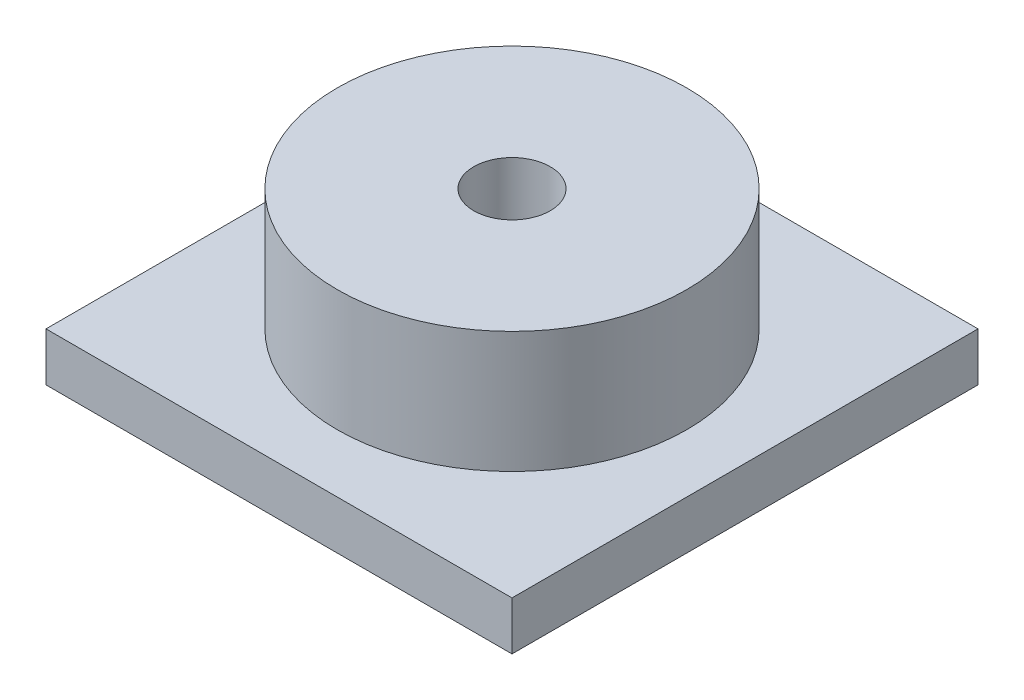
ISO-10303-21;
HEADER;
FILE_DESCRIPTION(('STEP AP214'),'2;1');
FILE_NAME('part.step','',(''),(''),'','','');
FILE_SCHEMA(('AUTOMOTIVE_DESIGN { 1 0 10303 214 1 1 1 1 }'));
ENDSEC;
DATA;
#1=APPLICATION_CONTEXT('core data for automotive mechanical design processes');
#2=APPLICATION_PROTOCOL_DEFINITION('international standard','automotive_design',2000,#1);
#3=PRODUCT_CONTEXT('',#1,'mechanical');
#4=PRODUCT('Part','Part','',(#3));
#5=PRODUCT_RELATED_PRODUCT_CATEGORY('part','',(#4));
#6=PRODUCT_DEFINITION_FORMATION('','',#4);
#7=PRODUCT_DEFINITION_CONTEXT('part definition',#1,'design');
#8=PRODUCT_DEFINITION('design','',#6,#7);
#9=PRODUCT_DEFINITION_SHAPE('','',#8);
#10=(LENGTH_UNIT() NAMED_UNIT(*) SI_UNIT(.MILLI.,.METRE.));
#11=(NAMED_UNIT(*) PLANE_ANGLE_UNIT() SI_UNIT($,.RADIAN.));
#12=(NAMED_UNIT(*) SI_UNIT($,.STERADIAN.) SOLID_ANGLE_UNIT());
#13=UNCERTAINTY_MEASURE_WITH_UNIT(LENGTH_MEASURE(1.E-05),#10,'distance_accuracy_value','');
#14=(GEOMETRIC_REPRESENTATION_CONTEXT(3) GLOBAL_UNCERTAINTY_ASSIGNED_CONTEXT((#13)) GLOBAL_UNIT_ASSIGNED_CONTEXT((#10,
#11,#12)) REPRESENTATION_CONTEXT('',''));
#15=CARTESIAN_POINT('',(0.,0.,0.));
#16=DIRECTION('',(0.,0.,1.));
#17=DIRECTION('',(1.,0.,0.));
#18=AXIS2_PLACEMENT_3D('',#15,#16,#17);
#19=CARTESIAN_POINT('',(0.,2.54,0.));
#20=DIRECTION('',(1.,0.,0.));
#21=DIRECTION('',(0.,0.,-1.));
#22=AXIS2_PLACEMENT_3D('',#19,#20,#21);
#23=PLANE('',#22);
#24=DIRECTION('',(0.,0.,1.));
#25=VECTOR('',#24,1.);
#26=CARTESIAN_POINT('',(0.,0.,0.));
#27=LINE('',#26,#25);
#28=CARTESIAN_POINT('',(0.,0.,0.));
#29=VERTEX_POINT('',#28);
#30=CARTESIAN_POINT('',(0.,0.,24.384));
#31=VERTEX_POINT('',#30);
#32=EDGE_CURVE('E99',#29,#31,#27,.T.);
#33=ORIENTED_EDGE('',*,*,#32,.T.);
#34=DIRECTION('',(0.,-1.,0.));
#35=VECTOR('',#34,1.);
#36=CARTESIAN_POINT('',(0.,2.54,24.384));
#37=LINE('',#36,#35);
#38=CARTESIAN_POINT('',(0.,2.54,24.384));
#39=VERTEX_POINT('',#38);
#40=EDGE_CURVE('E36',#39,#31,#37,.T.);
#41=ORIENTED_EDGE('',*,*,#40,.F.);
#42=DIRECTION('',(0.,0.,1.));
#43=VECTOR('',#42,1.);
#44=CARTESIAN_POINT('',(0.,2.54,0.));
#45=LINE('',#44,#43);
#46=CARTESIAN_POINT('',(0.,2.54,0.));
#47=VERTEX_POINT('',#46);
#48=EDGE_CURVE('E86',#47,#39,#45,.T.);
#49=ORIENTED_EDGE('',*,*,#48,.F.);
#50=DIRECTION('',(0.,-1.,0.));
#51=VECTOR('',#50,1.);
#52=CARTESIAN_POINT('',(0.,2.54,0.));
#53=LINE('',#52,#51);
#54=EDGE_CURVE('E95',#47,#29,#53,.T.);
#55=ORIENTED_EDGE('',*,*,#54,.T.);
#56=EDGE_LOOP('',(#33,#41,#49,#55));
#57=FACE_BOUND('',#56,.T.);
#58=ADVANCED_FACE('F33',(#57),#23,.F.);
#59=CARTESIAN_POINT('',(0.,2.54,24.384));
#60=DIRECTION('',(0.,0.,-1.));
#61=DIRECTION('',(-1.,0.,0.));
#62=AXIS2_PLACEMENT_3D('',#59,#60,#61);
#63=PLANE('',#62);
#64=DIRECTION('',(1.,0.,0.));
#65=VECTOR('',#64,1.);
#66=CARTESIAN_POINT('',(0.,0.,24.384));
#67=LINE('',#66,#65);
#68=CARTESIAN_POINT('',(24.384,0.,24.384));
#69=VERTEX_POINT('',#68);
#70=EDGE_CURVE('E91',#31,#69,#67,.T.);
#71=ORIENTED_EDGE('',*,*,#70,.T.);
#72=DIRECTION('',(0.,-1.,0.));
#73=VECTOR('',#72,1.);
#74=CARTESIAN_POINT('',(24.384,2.54,24.384));
#75=LINE('',#74,#73);
#76=CARTESIAN_POINT('',(24.384,2.54,24.384));
#77=VERTEX_POINT('',#76);
#78=EDGE_CURVE('E89',#77,#69,#75,.T.);
#79=ORIENTED_EDGE('',*,*,#78,.F.);
#80=DIRECTION('',(1.,0.,0.));
#81=VECTOR('',#80,1.);
#82=CARTESIAN_POINT('',(0.,2.54,24.384));
#83=LINE('',#82,#81);
#84=EDGE_CURVE('E81',#39,#77,#83,.T.);
#85=ORIENTED_EDGE('',*,*,#84,.F.);
#86=ORIENTED_EDGE('',*,*,#40,.T.);
#87=EDGE_LOOP('',(#71,#79,#85,#86));
#88=FACE_BOUND('',#87,.T.);
#89=ADVANCED_FACE('F90',(#88),#63,.F.);
#90=CARTESIAN_POINT('',(24.384,2.54,0.));
#91=DIRECTION('',(-1.,0.,0.));
#92=DIRECTION('',(0.,0.,1.));
#93=AXIS2_PLACEMENT_3D('',#90,#91,#92);
#94=PLANE('',#93);
#95=DIRECTION('',(0.,0.,-1.));
#96=VECTOR('',#95,1.);
#97=CARTESIAN_POINT('',(24.384,0.,0.));
#98=LINE('',#97,#96);
#99=CARTESIAN_POINT('',(24.384,0.,0.));
#100=VERTEX_POINT('',#99);
#101=EDGE_CURVE('E67',#69,#100,#98,.T.);
#102=ORIENTED_EDGE('',*,*,#101,.T.);
#103=DIRECTION('',(0.,-1.,0.));
#104=VECTOR('',#103,1.);
#105=CARTESIAN_POINT('',(24.384,2.54,0.));
#106=LINE('',#105,#104);
#107=CARTESIAN_POINT('',(24.384,2.54,0.));
#108=VERTEX_POINT('',#107);
#109=EDGE_CURVE('E92',#108,#100,#106,.T.);
#110=ORIENTED_EDGE('',*,*,#109,.F.);
#111=DIRECTION('',(0.,0.,-1.));
#112=VECTOR('',#111,1.);
#113=CARTESIAN_POINT('',(24.384,2.54,0.));
#114=LINE('',#113,#112);
#115=EDGE_CURVE('E84',#77,#108,#114,.T.);
#116=ORIENTED_EDGE('',*,*,#115,.F.);
#117=ORIENTED_EDGE('',*,*,#78,.T.);
#118=EDGE_LOOP('',(#102,#110,#116,#117));
#119=FACE_BOUND('',#118,.T.);
#120=ADVANCED_FACE('F93',(#119),#94,.F.);
#121=CARTESIAN_POINT('',(0.,2.54,0.));
#122=DIRECTION('',(0.,0.,1.));
#123=DIRECTION('',(1.,0.,0.));
#124=AXIS2_PLACEMENT_3D('',#121,#122,#123);
#125=PLANE('',#124);
#126=DIRECTION('',(-1.,0.,0.));
#127=VECTOR('',#126,1.);
#128=CARTESIAN_POINT('',(0.,0.,0.));
#129=LINE('',#128,#127);
#130=EDGE_CURVE('E73',#100,#29,#129,.T.);
#131=ORIENTED_EDGE('',*,*,#130,.T.);
#132=ORIENTED_EDGE('',*,*,#54,.F.);
#133=DIRECTION('',(-1.,0.,0.));
#134=VECTOR('',#133,1.);
#135=CARTESIAN_POINT('',(0.,2.54,0.));
#136=LINE('',#135,#134);
#137=EDGE_CURVE('E50',#108,#47,#136,.T.);
#138=ORIENTED_EDGE('',*,*,#137,.F.);
#139=ORIENTED_EDGE('',*,*,#109,.T.);
#140=EDGE_LOOP('',(#131,#132,#138,#139));
#141=FACE_BOUND('',#140,.T.);
#142=ADVANCED_FACE('F107',(#141),#125,.F.);
#143=CARTESIAN_POINT('',(0.,2.54,0.));
#144=DIRECTION('',(0.,1.,0.));
#145=DIRECTION('',(0.,0.,1.));
#146=AXIS2_PLACEMENT_3D('',#143,#144,#145);
#147=PLANE('',#146);
#148=CARTESIAN_POINT('',(12.192,2.54,12.192));
#149=DIRECTION('',(0.,1.,0.));
#150=DIRECTION('',(0.,0.,1.));
#151=AXIS2_PLACEMENT_3D('',#148,#149,#150);
#152=CIRCLE('',#151,9.14399999999999);
#153=CARTESIAN_POINT('',(12.192,2.54,21.336));
#154=VERTEX_POINT('',#153);
#155=EDGE_CURVE('E11',#154,#154,#152,.T.);
#156=ORIENTED_EDGE('',*,*,#155,.F.);
#157=EDGE_LOOP('',(#156));
#158=FACE_BOUND('',#157,.T.);
#159=ORIENTED_EDGE('',*,*,#48,.T.);
#160=ORIENTED_EDGE('',*,*,#84,.T.);
#161=ORIENTED_EDGE('',*,*,#115,.T.);
#162=ORIENTED_EDGE('',*,*,#137,.T.);
#163=EDGE_LOOP('',(#159,#160,#161,#162));
#164=FACE_BOUND('',#163,.T.);
#165=ADVANCED_FACE('F82',(#158,#164),#147,.T.);
#166=CARTESIAN_POINT('',(0.,0.,0.));
#167=DIRECTION('',(0.,1.,0.));
#168=DIRECTION('',(0.,0.,1.));
#169=AXIS2_PLACEMENT_3D('',#166,#167,#168);
#170=PLANE('',#169);
#171=CARTESIAN_POINT('',(12.192,0.,12.192));
#172=DIRECTION('',(0.,1.,0.));
#173=DIRECTION('',(0.,0.,1.));
#174=AXIS2_PLACEMENT_3D('',#171,#172,#173);
#175=CIRCLE('',#174,2.);
#176=CARTESIAN_POINT('',(12.192,0.,14.192));
#177=VERTEX_POINT('',#176);
#178=EDGE_CURVE('E115',#177,#177,#175,.T.);
#179=ORIENTED_EDGE('',*,*,#178,.T.);
#180=EDGE_LOOP('',(#179));
#181=FACE_BOUND('',#180,.T.);
#182=ORIENTED_EDGE('',*,*,#32,.F.);
#183=ORIENTED_EDGE('',*,*,#130,.F.);
#184=ORIENTED_EDGE('',*,*,#101,.F.);
#185=ORIENTED_EDGE('',*,*,#70,.F.);
#186=EDGE_LOOP('',(#182,#183,#184,#185));
#187=FACE_BOUND('',#186,.T.);
#188=ADVANCED_FACE('F110',(#181,#187),#170,.F.);
#189=CARTESIAN_POINT('',(12.192,8.89,12.192));
#190=DIRECTION('',(0.,-1.,0.));
#191=DIRECTION('',(0.,0.,-1.));
#192=AXIS2_PLACEMENT_3D('',#189,#190,#191);
#193=CYLINDRICAL_SURFACE('',#192,9.14399999999999);
#194=CARTESIAN_POINT('',(12.192,8.89,12.192));
#195=DIRECTION('',(0.,1.,0.));
#196=DIRECTION('',(0.,0.,1.));
#197=AXIS2_PLACEMENT_3D('',#194,#195,#196);
#198=CIRCLE('',#197,9.14399999999999);
#199=CARTESIAN_POINT('',(12.192,8.89,21.336));
#200=VERTEX_POINT('',#199);
#201=EDGE_CURVE('E102',#200,#200,#198,.T.);
#202=ORIENTED_EDGE('',*,*,#201,.F.);
#203=EDGE_LOOP('',(#202));
#204=FACE_BOUND('',#203,.T.);
#205=ORIENTED_EDGE('',*,*,#155,.T.);
#206=EDGE_LOOP('',(#205));
#207=FACE_BOUND('',#206,.T.);
#208=ADVANCED_FACE('F132',(#204,#207),#193,.T.);
#209=CARTESIAN_POINT('',(12.192,8.89,12.192));
#210=DIRECTION('',(0.,1.,0.));
#211=DIRECTION('',(0.,0.,1.));
#212=AXIS2_PLACEMENT_3D('',#209,#210,#211);
#213=PLANE('',#212);
#214=CARTESIAN_POINT('',(12.192,8.89,12.192));
#215=DIRECTION('',(0.,1.,0.));
#216=DIRECTION('',(0.,0.,1.));
#217=AXIS2_PLACEMENT_3D('',#214,#215,#216);
#218=CIRCLE('',#217,2.);
#219=CARTESIAN_POINT('',(12.192,8.89,14.192));
#220=VERTEX_POINT('',#219);
#221=EDGE_CURVE('E116',#220,#220,#218,.T.);
#222=ORIENTED_EDGE('',*,*,#221,.F.);
#223=EDGE_LOOP('',(#222));
#224=FACE_BOUND('',#223,.T.);
#225=ORIENTED_EDGE('',*,*,#201,.T.);
#226=EDGE_LOOP('',(#225));
#227=FACE_BOUND('',#226,.T.);
#228=ADVANCED_FACE('F126',(#224,#227),#213,.T.);
#229=CARTESIAN_POINT('',(12.192,0.,12.192));
#230=DIRECTION('',(0.,1.,0.));
#231=DIRECTION('',(0.,0.,1.));
#232=AXIS2_PLACEMENT_3D('',#229,#230,#231);
#233=CYLINDRICAL_SURFACE('',#232,2.);
#234=CARTESIAN_POINT('',(12.192,0.,14.192));
#235=CARTESIAN_POINT('',(12.192,0.0926041666666667,14.192));
#236=CARTESIAN_POINT('',(12.192,0.185208333333333,14.192));
#237=CARTESIAN_POINT('',(12.192,0.370416666666667,14.192));
#238=CARTESIAN_POINT('',(12.192,0.463020833333333,14.192));
#239=CARTESIAN_POINT('',(12.192,0.648229166666667,14.192));
#240=CARTESIAN_POINT('',(12.192,0.740833333333333,14.192));
#241=CARTESIAN_POINT('',(12.192,0.926041666666667,14.192));
#242=CARTESIAN_POINT('',(12.192,1.01864583333333,14.192));
#243=CARTESIAN_POINT('',(12.192,1.20385416666667,14.192));
#244=CARTESIAN_POINT('',(12.192,1.29645833333333,14.192));
#245=CARTESIAN_POINT('',(12.192,1.48166666666667,14.192));
#246=CARTESIAN_POINT('',(12.192,1.57427083333333,14.192));
#247=CARTESIAN_POINT('',(12.192,1.75947916666667,14.192));
#248=CARTESIAN_POINT('',(12.192,1.85208333333333,14.192));
#249=CARTESIAN_POINT('',(12.192,2.03729166666667,14.192));
#250=CARTESIAN_POINT('',(12.192,2.12989583333333,14.192));
#251=CARTESIAN_POINT('',(12.192,2.31510416666667,14.192));
#252=CARTESIAN_POINT('',(12.192,2.40770833333333,14.192));
#253=CARTESIAN_POINT('',(12.192,2.59291666666667,14.192));
#254=CARTESIAN_POINT('',(12.192,2.68552083333333,14.192));
#255=CARTESIAN_POINT('',(12.192,2.87072916666667,14.192));
#256=CARTESIAN_POINT('',(12.192,2.96333333333333,14.192));
#257=CARTESIAN_POINT('',(12.192,3.14854166666667,14.192));
#258=CARTESIAN_POINT('',(12.192,3.24114583333333,14.192));
#259=CARTESIAN_POINT('',(12.192,3.42635416666667,14.192));
#260=CARTESIAN_POINT('',(12.192,3.51895833333333,14.192));
#261=CARTESIAN_POINT('',(12.192,3.70416666666667,14.192));
#262=CARTESIAN_POINT('',(12.192,3.79677083333333,14.192));
#263=CARTESIAN_POINT('',(12.192,3.98197916666667,14.192));
#264=CARTESIAN_POINT('',(12.192,4.07458333333333,14.192));
#265=CARTESIAN_POINT('',(12.192,4.25979166666667,14.192));
#266=CARTESIAN_POINT('',(12.192,4.35239583333333,14.192));
#267=CARTESIAN_POINT('',(12.192,4.53760416666667,14.192));
#268=CARTESIAN_POINT('',(12.192,4.63020833333333,14.192));
#269=CARTESIAN_POINT('',(12.192,4.81541666666667,14.192));
#270=CARTESIAN_POINT('',(12.192,4.90802083333333,14.192));
#271=CARTESIAN_POINT('',(12.192,5.09322916666667,14.192));
#272=CARTESIAN_POINT('',(12.192,5.18583333333333,14.192));
#273=CARTESIAN_POINT('',(12.192,5.37104166666667,14.192));
#274=CARTESIAN_POINT('',(12.192,5.46364583333333,14.192));
#275=CARTESIAN_POINT('',(12.192,5.64885416666667,14.192));
#276=CARTESIAN_POINT('',(12.192,5.74145833333333,14.192));
#277=CARTESIAN_POINT('',(12.192,5.92666666666667,14.192));
#278=CARTESIAN_POINT('',(12.192,6.01927083333333,14.192));
#279=CARTESIAN_POINT('',(12.192,6.20447916666667,14.192));
#280=CARTESIAN_POINT('',(12.192,6.29708333333333,14.192));
#281=CARTESIAN_POINT('',(12.192,6.48229166666667,14.192));
#282=CARTESIAN_POINT('',(12.192,6.57489583333333,14.192));
#283=CARTESIAN_POINT('',(12.192,6.76010416666667,14.192));
#284=CARTESIAN_POINT('',(12.192,6.85270833333333,14.192));
#285=CARTESIAN_POINT('',(12.192,7.03791666666667,14.192));
#286=CARTESIAN_POINT('',(12.192,7.13052083333333,14.192));
#287=CARTESIAN_POINT('',(12.192,7.31572916666667,14.192));
#288=CARTESIAN_POINT('',(12.192,7.40833333333333,14.192));
#289=CARTESIAN_POINT('',(12.192,7.59354166666667,14.192));
#290=CARTESIAN_POINT('',(12.192,7.68614583333333,14.192));
#291=CARTESIAN_POINT('',(12.192,7.87135416666667,14.192));
#292=CARTESIAN_POINT('',(12.192,7.96395833333333,14.192));
#293=CARTESIAN_POINT('',(12.192,8.14916666666667,14.192));
#294=CARTESIAN_POINT('',(12.192,8.24177083333333,14.192));
#295=CARTESIAN_POINT('',(12.192,8.42697916666667,14.192));
#296=CARTESIAN_POINT('',(12.192,8.51958333333333,14.192));
#297=CARTESIAN_POINT('',(12.192,8.70479166666667,14.192));
#298=CARTESIAN_POINT('',(12.192,8.79739583333333,14.192));
#299=CARTESIAN_POINT('',(12.192,8.89,14.192));
#300=B_SPLINE_CURVE_WITH_KNOTS('',3,(#234,#235,#236,#237,#238,#239,#240,#241,#242,#243,#244,
#245,#246,#247,#248,#249,#250,#251,#252,#253,#254,#255,#256,#257,#258,#259,#260,#261,#262,#263,
#264,#265,#266,#267,#268,#269,#270,#271,#272,#273,#274,#275,#276,#277,#278,#279,#280,#281,#282,
#283,#284,#285,#286,#287,#288,#289,#290,#291,#292,#293,#294,#295,#296,#297,#298,#299),
.UNSPECIFIED.,.F.,.F.,(4,2,2,2,2,2,2,2,2,2,2,2,2,2,2,2,2,2,2,2,2,2,2,2,2,2,2,2,2,2,2,2,4),(0.,
0.2778125,0.555625,0.8334375,1.11125,1.3890625,1.666875,1.9446875,2.2225,2.5003125,2.778125,
3.0559375,3.33375,3.6115625,3.889375,4.1671875,4.445,4.7228125,5.000625,5.2784375,5.55625,
5.8340625,6.111875,6.3896875,6.6675,6.9453125,7.223125,7.5009375,7.77875,8.0565625,8.334375,
8.6121875,8.89),.UNSPECIFIED.);
#301=EDGE_CURVE('BSEAM123',#177,#220,#300,.T.);
#302=ORIENTED_EDGE('',*,*,#178,.F.);
#303=ORIENTED_EDGE('',*,*,#221,.T.);
#304=ORIENTED_EDGE('',*,*,#301,.T.);
#305=ORIENTED_EDGE('',*,*,#301,.F.);
#306=EDGE_LOOP('',(#302,#304,#303,#305));
#307=FACE_BOUND('',#306,.T.);
#308=ADVANCED_FACE('F123',(#307),#233,.F.);
#309=CLOSED_SHELL('',(#58,#89,#120,#142,#165,#188,#208,#228,#308));
#310=MANIFOLD_SOLID_BREP('B2',#309);
#311=ADVANCED_BREP_SHAPE_REPRESENTATION('',(#18,#310),#14);
#312=SHAPE_DEFINITION_REPRESENTATION(#9,#311);
ENDSEC;
END-ISO-10303-21;
